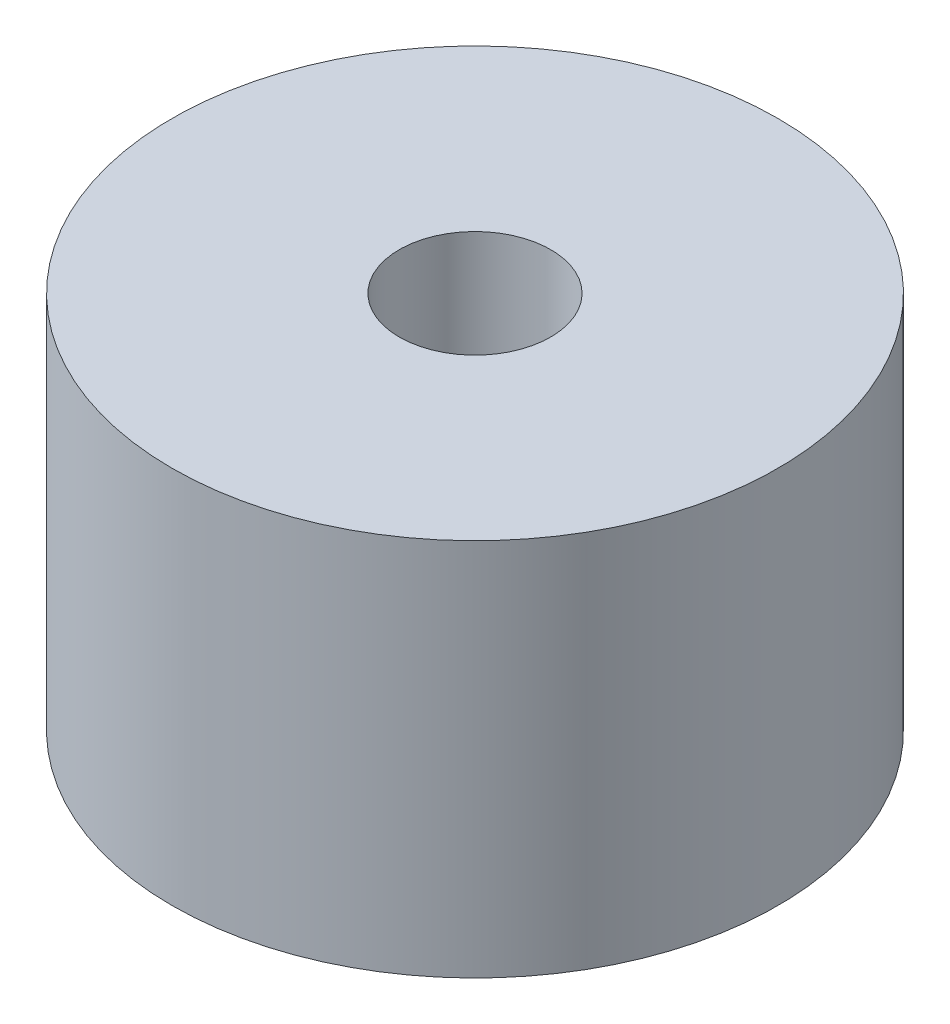
ISO-10303-21;
HEADER;
FILE_DESCRIPTION(('STEP AP214'),'2;1');
FILE_NAME('part.step','',(''),(''),'','','');
FILE_SCHEMA(('AUTOMOTIVE_DESIGN { 1 0 10303 214 1 1 1 1 }'));
ENDSEC;
DATA;
#1=APPLICATION_CONTEXT('core data for automotive mechanical design processes');
#2=APPLICATION_PROTOCOL_DEFINITION('international standard','automotive_design',2000,#1);
#3=PRODUCT_CONTEXT('',#1,'mechanical');
#4=PRODUCT('Part','Part','',(#3));
#5=PRODUCT_RELATED_PRODUCT_CATEGORY('part','',(#4));
#6=PRODUCT_DEFINITION_FORMATION('','',#4);
#7=PRODUCT_DEFINITION_CONTEXT('part definition',#1,'design');
#8=PRODUCT_DEFINITION('design','',#6,#7);
#9=PRODUCT_DEFINITION_SHAPE('','',#8);
#10=(LENGTH_UNIT() NAMED_UNIT(*) SI_UNIT(.MILLI.,.METRE.));
#11=(NAMED_UNIT(*) PLANE_ANGLE_UNIT() SI_UNIT($,.RADIAN.));
#12=(NAMED_UNIT(*) SI_UNIT($,.STERADIAN.) SOLID_ANGLE_UNIT());
#13=UNCERTAINTY_MEASURE_WITH_UNIT(LENGTH_MEASURE(1.E-05),#10,'distance_accuracy_value','');
#14=(GEOMETRIC_REPRESENTATION_CONTEXT(3) GLOBAL_UNCERTAINTY_ASSIGNED_CONTEXT((#13)) GLOBAL_UNIT_ASSIGNED_CONTEXT((#10,
#11,#12)) REPRESENTATION_CONTEXT('',''));
#15=CARTESIAN_POINT('',(0.,0.,0.));
#16=DIRECTION('',(0.,0.,1.));
#17=DIRECTION('',(1.,0.,0.));
#18=AXIS2_PLACEMENT_3D('',#15,#16,#17);
#19=CARTESIAN_POINT('',(0.,5.,0.));
#20=DIRECTION('',(0.,-1.,0.));
#21=DIRECTION('',(0.,0.,-1.));
#22=AXIS2_PLACEMENT_3D('',#19,#20,#21);
#23=CYLINDRICAL_SURFACE('',#22,4.);
#24=CARTESIAN_POINT('',(0.,5.,0.));
#25=DIRECTION('',(0.,1.,0.));
#26=DIRECTION('',(0.,0.,1.));
#27=AXIS2_PLACEMENT_3D('',#24,#25,#26);
#28=CIRCLE('',#27,4.);
#29=CARTESIAN_POINT('',(0.,5.,4.));
#30=VERTEX_POINT('',#29);
#31=EDGE_CURVE('E10',#30,#30,#28,.T.);
#32=ORIENTED_EDGE('',*,*,#31,.F.);
#33=EDGE_LOOP('',(#32));
#34=FACE_BOUND('',#33,.T.);
#35=CARTESIAN_POINT('',(0.,0.,0.));
#36=DIRECTION('',(0.,1.,0.));
#37=DIRECTION('',(0.,0.,1.));
#38=AXIS2_PLACEMENT_3D('',#35,#36,#37);
#39=CIRCLE('',#38,4.);
#40=CARTESIAN_POINT('',(0.,0.,4.));
#41=VERTEX_POINT('',#40);
#42=EDGE_CURVE('E40',#41,#41,#39,.T.);
#43=ORIENTED_EDGE('',*,*,#42,.T.);
#44=EDGE_LOOP('',(#43));
#45=FACE_BOUND('',#44,.T.);
#46=ADVANCED_FACE('F37',(#34,#45),#23,.T.);
#47=CARTESIAN_POINT('',(0.,5.,0.));
#48=DIRECTION('',(0.,1.,0.));
#49=DIRECTION('',(0.,0.,1.));
#50=AXIS2_PLACEMENT_3D('',#47,#48,#49);
#51=PLANE('',#50);
#52=CARTESIAN_POINT('',(0.,5.,0.));
#53=DIRECTION('',(0.,1.,0.));
#54=DIRECTION('',(0.,0.,1.));
#55=AXIS2_PLACEMENT_3D('',#52,#53,#54);
#56=CIRCLE('',#55,1.);
#57=CARTESIAN_POINT('',(0.,5.,1.));
#58=VERTEX_POINT('',#57);
#59=EDGE_CURVE('E51',#58,#58,#56,.T.);
#60=ORIENTED_EDGE('',*,*,#59,.F.);
#61=EDGE_LOOP('',(#60));
#62=FACE_BOUND('',#61,.T.);
#63=ORIENTED_EDGE('',*,*,#31,.T.);
#64=EDGE_LOOP('',(#63));
#65=FACE_BOUND('',#64,.T.);
#66=ADVANCED_FACE('F68',(#62,#65),#51,.T.);
#67=CARTESIAN_POINT('',(0.,0.,0.));
#68=DIRECTION('',(0.,1.,0.));
#69=DIRECTION('',(0.,0.,1.));
#70=AXIS2_PLACEMENT_3D('',#67,#68,#69);
#71=PLANE('',#70);
#72=CARTESIAN_POINT('',(0.,0.,0.));
#73=DIRECTION('',(0.,1.,0.));
#74=DIRECTION('',(0.,0.,1.));
#75=AXIS2_PLACEMENT_3D('',#72,#73,#74);
#76=CIRCLE('',#75,1.);
#77=CARTESIAN_POINT('',(0.,0.,1.));
#78=VERTEX_POINT('',#77);
#79=EDGE_CURVE('E49',#78,#78,#76,.T.);
#80=ORIENTED_EDGE('',*,*,#79,.T.);
#81=EDGE_LOOP('',(#80));
#82=FACE_BOUND('',#81,.T.);
#83=ORIENTED_EDGE('',*,*,#42,.F.);
#84=EDGE_LOOP('',(#83));
#85=FACE_BOUND('',#84,.T.);
#86=ADVANCED_FACE('F59',(#82,#85),#71,.F.);
#87=CARTESIAN_POINT('',(0.,0.,0.));
#88=DIRECTION('',(0.,1.,0.));
#89=DIRECTION('',(0.,0.,1.));
#90=AXIS2_PLACEMENT_3D('',#87,#88,#89);
#91=CYLINDRICAL_SURFACE('',#90,1.);
#92=ORIENTED_EDGE('',*,*,#79,.F.);
#93=EDGE_LOOP('',(#92));
#94=FACE_BOUND('',#93,.T.);
#95=ORIENTED_EDGE('',*,*,#59,.T.);
#96=EDGE_LOOP('',(#95));
#97=FACE_BOUND('',#96,.T.);
#98=ADVANCED_FACE('F62',(#94,#97),#91,.F.);
#99=CLOSED_SHELL('',(#46,#66,#86,#98));
#100=MANIFOLD_SOLID_BREP('B2',#99);
#101=ADVANCED_BREP_SHAPE_REPRESENTATION('',(#18,#100),#14);
#102=SHAPE_DEFINITION_REPRESENTATION(#9,#101);
ENDSEC;
END-ISO-10303-21;
